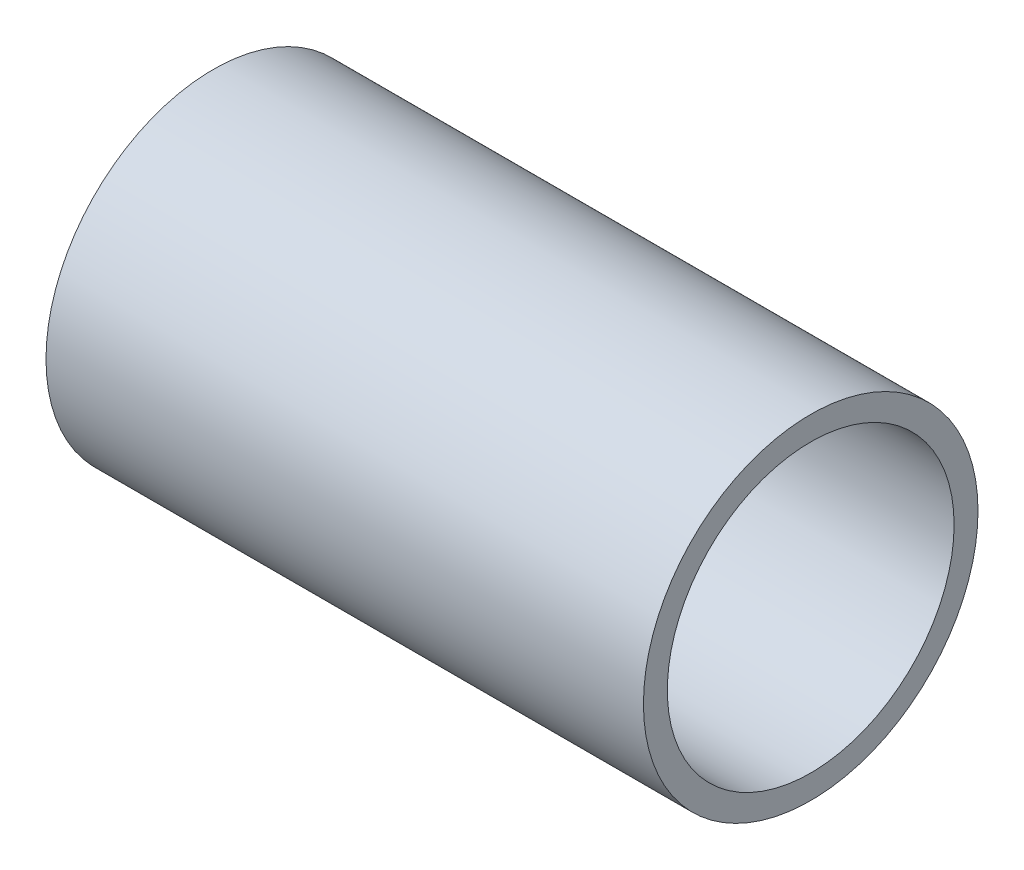
ISO-10303-21;
HEADER;
FILE_DESCRIPTION(('STEP AP214'),'2;1');
FILE_NAME('part.step','',(''),(''),'','','');
FILE_SCHEMA(('AUTOMOTIVE_DESIGN { 1 0 10303 214 1 1 1 1 }'));
ENDSEC;
DATA;
#1=APPLICATION_CONTEXT('core data for automotive mechanical design processes');
#2=APPLICATION_PROTOCOL_DEFINITION('international standard','automotive_design',2000,#1);
#3=PRODUCT_CONTEXT('',#1,'mechanical');
#4=PRODUCT('Part','Part','',(#3));
#5=PRODUCT_RELATED_PRODUCT_CATEGORY('part','',(#4));
#6=PRODUCT_DEFINITION_FORMATION('','',#4);
#7=PRODUCT_DEFINITION_CONTEXT('part definition',#1,'design');
#8=PRODUCT_DEFINITION('design','',#6,#7);
#9=PRODUCT_DEFINITION_SHAPE('','',#8);
#10=(LENGTH_UNIT() NAMED_UNIT(*) SI_UNIT(.MILLI.,.METRE.));
#11=(NAMED_UNIT(*) PLANE_ANGLE_UNIT() SI_UNIT($,.RADIAN.));
#12=(NAMED_UNIT(*) SI_UNIT($,.STERADIAN.) SOLID_ANGLE_UNIT());
#13=UNCERTAINTY_MEASURE_WITH_UNIT(LENGTH_MEASURE(1.E-05),#10,'distance_accuracy_value','');
#14=(GEOMETRIC_REPRESENTATION_CONTEXT(3) GLOBAL_UNCERTAINTY_ASSIGNED_CONTEXT((#13)) GLOBAL_UNIT_ASSIGNED_CONTEXT((#10,
#11,#12)) REPRESENTATION_CONTEXT('',''));
#15=CARTESIAN_POINT('',(0.,0.,0.));
#16=DIRECTION('',(0.,0.,1.));
#17=DIRECTION('',(1.,0.,0.));
#18=AXIS2_PLACEMENT_3D('',#15,#16,#17);
#19=CARTESIAN_POINT('',(-143.225505807351,-1.76370111659328,19.9949035377358));
#20=DIRECTION('',(-1.,0.,0.));
#21=DIRECTION('',(0.,0.,1.));
#22=AXIS2_PLACEMENT_3D('',#19,#20,#21);
#23=PLANE('',#22);
#24=CARTESIAN_POINT('',(-143.225505807351,-1.76370111659328,19.9949035377358));
#25=DIRECTION('',(-1.,0.,0.));
#26=DIRECTION('',(0.,0.,1.));
#27=AXIS2_PLACEMENT_3D('',#24,#25,#26);
#28=CIRCLE('',#27,22.225);
#29=CARTESIAN_POINT('',(-143.225505807351,-1.76370111659328,-2.23009646226419));
#30=VERTEX_POINT('',#29);
#31=EDGE_CURVE('E10',#30,#30,#28,.T.);
#32=ORIENTED_EDGE('',*,*,#31,.T.);
#33=EDGE_LOOP('',(#32));
#34=FACE_BOUND('',#33,.T.);
#35=CARTESIAN_POINT('',(-143.225505807351,-1.76370111659328,19.9949035377358));
#36=DIRECTION('',(-1.,0.,0.));
#37=DIRECTION('',(0.,0.,1.));
#38=AXIS2_PLACEMENT_3D('',#35,#36,#37);
#39=CIRCLE('',#38,19.051016);
#40=CARTESIAN_POINT('',(-143.225505807351,-1.76370111659328,0.943887537735805));
#41=VERTEX_POINT('',#40);
#42=EDGE_CURVE('E46',#41,#41,#39,.T.);
#43=ORIENTED_EDGE('',*,*,#42,.F.);
#44=EDGE_LOOP('',(#43));
#45=FACE_BOUND('',#44,.T.);
#46=ADVANCED_FACE('F35',(#34,#45),#23,.T.);
#47=CARTESIAN_POINT('',(-63.8505058073509,-1.76370111659328,19.9949035377358));
#48=DIRECTION('',(-1.,0.,0.));
#49=DIRECTION('',(0.,0.,1.));
#50=AXIS2_PLACEMENT_3D('',#47,#48,#49);
#51=PLANE('',#50);
#52=CARTESIAN_POINT('',(-63.8505058073509,-1.76370111659328,19.9949035377358));
#53=DIRECTION('',(-1.,0.,0.));
#54=DIRECTION('',(0.,0.,1.));
#55=AXIS2_PLACEMENT_3D('',#52,#53,#54);
#56=CIRCLE('',#55,22.225);
#57=CARTESIAN_POINT('',(-63.8505058073509,-1.76370111659328,-2.23009646226419));
#58=VERTEX_POINT('',#57);
#59=EDGE_CURVE('E39',#58,#58,#56,.T.);
#60=ORIENTED_EDGE('',*,*,#59,.F.);
#61=EDGE_LOOP('',(#60));
#62=FACE_BOUND('',#61,.T.);
#63=CARTESIAN_POINT('',(-63.8505058073509,-1.76370111659328,19.9949035377358));
#64=DIRECTION('',(-1.,0.,0.));
#65=DIRECTION('',(0.,0.,1.));
#66=AXIS2_PLACEMENT_3D('',#63,#64,#65);
#67=CIRCLE('',#66,19.051016);
#68=CARTESIAN_POINT('',(-63.8505058073509,-1.76370111659328,0.943887537735805));
#69=VERTEX_POINT('',#68);
#70=EDGE_CURVE('E48',#69,#69,#67,.T.);
#71=ORIENTED_EDGE('',*,*,#70,.T.);
#72=EDGE_LOOP('',(#71));
#73=FACE_BOUND('',#72,.T.);
#74=ADVANCED_FACE('F58',(#62,#73),#51,.F.);
#75=CARTESIAN_POINT('',(-143.225505807351,-1.76370111659328,19.9949035377358));
#76=DIRECTION('',(1.,0.,0.));
#77=DIRECTION('',(0.,0.,-1.));
#78=AXIS2_PLACEMENT_3D('',#75,#76,#77);
#79=CYLINDRICAL_SURFACE('',#78,22.225);
#80=CARTESIAN_POINT('',(-143.225505807351,-1.76370111659328,-2.23009646226419));
#81=CARTESIAN_POINT('',(-142.398682890684,-1.76370111659328,-2.23009646226419));
#82=CARTESIAN_POINT('',(-141.571859974018,-1.76370111659328,-2.23009646226419));
#83=CARTESIAN_POINT('',(-139.918214140684,-1.76370111659328,-2.23009646226419));
#84=CARTESIAN_POINT('',(-139.091391224018,-1.76370111659328,-2.23009646226419));
#85=CARTESIAN_POINT('',(-137.437745390684,-1.76370111659328,-2.23009646226419));
#86=CARTESIAN_POINT('',(-136.610922474018,-1.76370111659328,-2.23009646226419));
#87=CARTESIAN_POINT('',(-134.957276640684,-1.76370111659328,-2.23009646226419));
#88=CARTESIAN_POINT('',(-134.130453724018,-1.76370111659328,-2.23009646226419));
#89=CARTESIAN_POINT('',(-132.476807890684,-1.76370111659328,-2.23009646226419));
#90=CARTESIAN_POINT('',(-131.649984974018,-1.76370111659328,-2.23009646226419));
#91=CARTESIAN_POINT('',(-129.996339140684,-1.76370111659328,-2.23009646226419));
#92=CARTESIAN_POINT('',(-129.169516224018,-1.76370111659328,-2.23009646226419));
#93=CARTESIAN_POINT('',(-127.515870390684,-1.76370111659328,-2.23009646226419));
#94=CARTESIAN_POINT('',(-126.689047474018,-1.76370111659328,-2.23009646226419));
#95=CARTESIAN_POINT('',(-125.035401640684,-1.76370111659328,-2.23009646226419));
#96=CARTESIAN_POINT('',(-124.208578724018,-1.76370111659328,-2.23009646226419));
#97=CARTESIAN_POINT('',(-122.554932890684,-1.76370111659328,-2.23009646226419));
#98=CARTESIAN_POINT('',(-121.728109974018,-1.76370111659328,-2.23009646226419));
#99=CARTESIAN_POINT('',(-120.074464140684,-1.76370111659328,-2.23009646226419));
#100=CARTESIAN_POINT('',(-119.247641224018,-1.76370111659328,-2.23009646226419));
#101=CARTESIAN_POINT('',(-117.593995390684,-1.76370111659328,-2.23009646226419));
#102=CARTESIAN_POINT('',(-116.767172474018,-1.76370111659328,-2.23009646226419));
#103=CARTESIAN_POINT('',(-115.113526640684,-1.76370111659328,-2.23009646226419));
#104=CARTESIAN_POINT('',(-114.286703724018,-1.76370111659328,-2.23009646226419));
#105=CARTESIAN_POINT('',(-112.633057890684,-1.76370111659328,-2.23009646226419));
#106=CARTESIAN_POINT('',(-111.806234974018,-1.76370111659328,-2.23009646226419));
#107=CARTESIAN_POINT('',(-110.152589140684,-1.76370111659328,-2.23009646226419));
#108=CARTESIAN_POINT('',(-109.325766224018,-1.76370111659328,-2.23009646226419));
#109=CARTESIAN_POINT('',(-107.672120390684,-1.76370111659328,-2.23009646226419));
#110=CARTESIAN_POINT('',(-106.845297474018,-1.76370111659328,-2.23009646226419));
#111=CARTESIAN_POINT('',(-105.191651640684,-1.76370111659328,-2.23009646226419));
#112=CARTESIAN_POINT('',(-104.364828724018,-1.76370111659328,-2.23009646226419));
#113=CARTESIAN_POINT('',(-102.711182890684,-1.76370111659328,-2.23009646226419));
#114=CARTESIAN_POINT('',(-101.884359974018,-1.76370111659328,-2.23009646226419));
#115=CARTESIAN_POINT('',(-100.230714140684,-1.76370111659328,-2.23009646226419));
#116=CARTESIAN_POINT('',(-99.4038912240176,-1.76370111659328,-2.23009646226419));
#117=CARTESIAN_POINT('',(-97.7502453906843,-1.76370111659328,-2.23009646226419));
#118=CARTESIAN_POINT('',(-96.9234224740176,-1.76370111659328,-2.23009646226419));
#119=CARTESIAN_POINT('',(-95.2697766406843,-1.76370111659328,-2.23009646226419));
#120=CARTESIAN_POINT('',(-94.4429537240176,-1.76370111659328,-2.23009646226419));
#121=CARTESIAN_POINT('',(-92.7893078906843,-1.76370111659328,-2.23009646226419));
#122=CARTESIAN_POINT('',(-91.9624849740176,-1.76370111659328,-2.23009646226419));
#123=CARTESIAN_POINT('',(-90.3088391406843,-1.76370111659328,-2.23009646226419));
#124=CARTESIAN_POINT('',(-89.4820162240176,-1.76370111659328,-2.23009646226419));
#125=CARTESIAN_POINT('',(-87.8283703906843,-1.76370111659328,-2.23009646226419));
#126=CARTESIAN_POINT('',(-87.0015474740176,-1.76370111659328,-2.23009646226419));
#127=CARTESIAN_POINT('',(-85.3479016406843,-1.76370111659328,-2.23009646226419));
#128=CARTESIAN_POINT('',(-84.5210787240176,-1.76370111659328,-2.23009646226419));
#129=CARTESIAN_POINT('',(-82.8674328906843,-1.76370111659328,-2.23009646226419));
#130=CARTESIAN_POINT('',(-82.0406099740176,-1.76370111659328,-2.23009646226419));
#131=CARTESIAN_POINT('',(-80.3869641406842,-1.76370111659328,-2.23009646226419));
#132=CARTESIAN_POINT('',(-79.5601412240176,-1.76370111659328,-2.23009646226419));
#133=CARTESIAN_POINT('',(-77.9064953906843,-1.76370111659328,-2.23009646226419));
#134=CARTESIAN_POINT('',(-77.0796724740176,-1.76370111659328,-2.23009646226419));
#135=CARTESIAN_POINT('',(-75.4260266406843,-1.76370111659328,-2.23009646226419));
#136=CARTESIAN_POINT('',(-74.5992037240176,-1.76370111659328,-2.23009646226419));
#137=CARTESIAN_POINT('',(-72.9455578906843,-1.76370111659328,-2.23009646226419));
#138=CARTESIAN_POINT('',(-72.1187349740176,-1.76370111659328,-2.23009646226419));
#139=CARTESIAN_POINT('',(-70.4650891406843,-1.76370111659328,-2.23009646226419));
#140=CARTESIAN_POINT('',(-69.6382662240176,-1.76370111659328,-2.23009646226419));
#141=CARTESIAN_POINT('',(-67.9846203906843,-1.76370111659328,-2.23009646226419));
#142=CARTESIAN_POINT('',(-67.1577974740176,-1.76370111659328,-2.23009646226419));
#143=CARTESIAN_POINT('',(-65.5041516406843,-1.76370111659328,-2.23009646226419));
#144=CARTESIAN_POINT('',(-64.6773287240176,-1.76370111659328,-2.23009646226419));
#145=CARTESIAN_POINT('',(-63.8505058073509,-1.76370111659328,-2.23009646226419));
#146=B_SPLINE_CURVE_WITH_KNOTS('',3,(#80,#81,#82,#83,#84,#85,#86,#87,#88,#89,#90,#91,#92,#93,
#94,#95,#96,#97,#98,#99,#100,#101,#102,#103,#104,#105,#106,#107,#108,#109,#110,#111,#112,#113,
#114,#115,#116,#117,#118,#119,#120,#121,#122,#123,#124,#125,#126,#127,#128,#129,#130,#131,#132,
#133,#134,#135,#136,#137,#138,#139,#140,#141,#142,#143,#144,#145),.UNSPECIFIED.,.F.,.F.,(4,2,2,
2,2,2,2,2,2,2,2,2,2,2,2,2,2,2,2,2,2,2,2,2,2,2,2,2,2,2,2,2,4),(0.,2.48046874999999,
4.96093749999998,7.44140624999998,9.921875,12.40234375,14.8828125,17.36328125,19.84375,
22.32421875,24.8046875,27.28515625,29.765625,32.24609375,34.7265625,37.20703125,39.6875,
42.16796875,44.6484375,47.12890625,49.609375,52.08984375,54.5703125,57.05078125,59.53125,
62.01171875,64.4921875,66.97265625,69.453125,71.93359375,74.4140625,76.89453125,79.375),.UNSPECIFIED.);
#147=EDGE_CURVE('BSEAM37',#30,#58,#146,.T.);
#148=ORIENTED_EDGE('',*,*,#31,.F.);
#149=ORIENTED_EDGE('',*,*,#59,.T.);
#150=ORIENTED_EDGE('',*,*,#147,.T.);
#151=ORIENTED_EDGE('',*,*,#147,.F.);
#152=EDGE_LOOP('',(#148,#150,#149,#151));
#153=FACE_BOUND('',#152,.T.);
#154=ADVANCED_FACE('F37',(#153),#79,.T.);
#155=CARTESIAN_POINT('',(-143.225505807351,-1.76370111659328,19.9949035377358));
#156=DIRECTION('',(1.,0.,0.));
#157=DIRECTION('',(0.,0.,-1.));
#158=AXIS2_PLACEMENT_3D('',#155,#156,#157);
#159=CYLINDRICAL_SURFACE('',#158,19.051016);
#160=CARTESIAN_POINT('',(-143.225505807351,-1.76370111659328,0.943887537735805));
#161=CARTESIAN_POINT('',(-142.398682890684,-1.76370111659328,0.943887537735805));
#162=CARTESIAN_POINT('',(-141.571859974018,-1.76370111659328,0.943887537735805));
#163=CARTESIAN_POINT('',(-139.918214140684,-1.76370111659328,0.943887537735805));
#164=CARTESIAN_POINT('',(-139.091391224018,-1.76370111659328,0.943887537735805));
#165=CARTESIAN_POINT('',(-137.437745390684,-1.76370111659328,0.943887537735805));
#166=CARTESIAN_POINT('',(-136.610922474018,-1.76370111659328,0.943887537735805));
#167=CARTESIAN_POINT('',(-134.957276640684,-1.76370111659328,0.943887537735805));
#168=CARTESIAN_POINT('',(-134.130453724018,-1.76370111659328,0.943887537735805));
#169=CARTESIAN_POINT('',(-132.476807890684,-1.76370111659328,0.943887537735805));
#170=CARTESIAN_POINT('',(-131.649984974018,-1.76370111659328,0.943887537735805));
#171=CARTESIAN_POINT('',(-129.996339140684,-1.76370111659328,0.943887537735805));
#172=CARTESIAN_POINT('',(-129.169516224018,-1.76370111659328,0.943887537735805));
#173=CARTESIAN_POINT('',(-127.515870390684,-1.76370111659328,0.943887537735805));
#174=CARTESIAN_POINT('',(-126.689047474018,-1.76370111659328,0.943887537735805));
#175=CARTESIAN_POINT('',(-125.035401640684,-1.76370111659328,0.943887537735805));
#176=CARTESIAN_POINT('',(-124.208578724018,-1.76370111659328,0.943887537735805));
#177=CARTESIAN_POINT('',(-122.554932890684,-1.76370111659328,0.943887537735805));
#178=CARTESIAN_POINT('',(-121.728109974018,-1.76370111659328,0.943887537735805));
#179=CARTESIAN_POINT('',(-120.074464140684,-1.76370111659328,0.943887537735805));
#180=CARTESIAN_POINT('',(-119.247641224018,-1.76370111659328,0.943887537735805));
#181=CARTESIAN_POINT('',(-117.593995390684,-1.76370111659328,0.943887537735805));
#182=CARTESIAN_POINT('',(-116.767172474018,-1.76370111659328,0.943887537735805));
#183=CARTESIAN_POINT('',(-115.113526640684,-1.76370111659328,0.943887537735805));
#184=CARTESIAN_POINT('',(-114.286703724018,-1.76370111659328,0.943887537735805));
#185=CARTESIAN_POINT('',(-112.633057890684,-1.76370111659328,0.943887537735805));
#186=CARTESIAN_POINT('',(-111.806234974018,-1.76370111659328,0.943887537735805));
#187=CARTESIAN_POINT('',(-110.152589140684,-1.76370111659328,0.943887537735805));
#188=CARTESIAN_POINT('',(-109.325766224018,-1.76370111659328,0.943887537735805));
#189=CARTESIAN_POINT('',(-107.672120390684,-1.76370111659328,0.943887537735805));
#190=CARTESIAN_POINT('',(-106.845297474018,-1.76370111659328,0.943887537735805));
#191=CARTESIAN_POINT('',(-105.191651640684,-1.76370111659328,0.943887537735805));
#192=CARTESIAN_POINT('',(-104.364828724018,-1.76370111659328,0.943887537735805));
#193=CARTESIAN_POINT('',(-102.711182890684,-1.76370111659328,0.943887537735805));
#194=CARTESIAN_POINT('',(-101.884359974018,-1.76370111659328,0.943887537735805));
#195=CARTESIAN_POINT('',(-100.230714140684,-1.76370111659328,0.943887537735805));
#196=CARTESIAN_POINT('',(-99.4038912240176,-1.76370111659328,0.943887537735805));
#197=CARTESIAN_POINT('',(-97.7502453906843,-1.76370111659328,0.943887537735805));
#198=CARTESIAN_POINT('',(-96.9234224740176,-1.76370111659328,0.943887537735805));
#199=CARTESIAN_POINT('',(-95.2697766406843,-1.76370111659328,0.943887537735805));
#200=CARTESIAN_POINT('',(-94.4429537240176,-1.76370111659328,0.943887537735805));
#201=CARTESIAN_POINT('',(-92.7893078906843,-1.76370111659328,0.943887537735805));
#202=CARTESIAN_POINT('',(-91.9624849740176,-1.76370111659328,0.943887537735805));
#203=CARTESIAN_POINT('',(-90.3088391406843,-1.76370111659328,0.943887537735805));
#204=CARTESIAN_POINT('',(-89.4820162240176,-1.76370111659328,0.943887537735805));
#205=CARTESIAN_POINT('',(-87.8283703906843,-1.76370111659328,0.943887537735805));
#206=CARTESIAN_POINT('',(-87.0015474740176,-1.76370111659328,0.943887537735805));
#207=CARTESIAN_POINT('',(-85.3479016406843,-1.76370111659328,0.943887537735805));
#208=CARTESIAN_POINT('',(-84.5210787240176,-1.76370111659328,0.943887537735805));
#209=CARTESIAN_POINT('',(-82.8674328906843,-1.76370111659328,0.943887537735805));
#210=CARTESIAN_POINT('',(-82.0406099740176,-1.76370111659328,0.943887537735805));
#211=CARTESIAN_POINT('',(-80.3869641406842,-1.76370111659328,0.943887537735805));
#212=CARTESIAN_POINT('',(-79.5601412240176,-1.76370111659328,0.943887537735805));
#213=CARTESIAN_POINT('',(-77.9064953906843,-1.76370111659328,0.943887537735805));
#214=CARTESIAN_POINT('',(-77.0796724740176,-1.76370111659328,0.943887537735805));
#215=CARTESIAN_POINT('',(-75.4260266406843,-1.76370111659328,0.943887537735805));
#216=CARTESIAN_POINT('',(-74.5992037240176,-1.76370111659328,0.943887537735805));
#217=CARTESIAN_POINT('',(-72.9455578906843,-1.76370111659328,0.943887537735805));
#218=CARTESIAN_POINT('',(-72.1187349740176,-1.76370111659328,0.943887537735805));
#219=CARTESIAN_POINT('',(-70.4650891406843,-1.76370111659328,0.943887537735805));
#220=CARTESIAN_POINT('',(-69.6382662240176,-1.76370111659328,0.943887537735805));
#221=CARTESIAN_POINT('',(-67.9846203906843,-1.76370111659328,0.943887537735805));
#222=CARTESIAN_POINT('',(-67.1577974740176,-1.76370111659328,0.943887537735805));
#223=CARTESIAN_POINT('',(-65.5041516406843,-1.76370111659328,0.943887537735805));
#224=CARTESIAN_POINT('',(-64.6773287240176,-1.76370111659328,0.943887537735805));
#225=CARTESIAN_POINT('',(-63.8505058073509,-1.76370111659328,0.943887537735805));
#226=B_SPLINE_CURVE_WITH_KNOTS('',3,(#160,#161,#162,#163,#164,#165,#166,#167,#168,#169,#170,
#171,#172,#173,#174,#175,#176,#177,#178,#179,#180,#181,#182,#183,#184,#185,#186,#187,#188,#189,
#190,#191,#192,#193,#194,#195,#196,#197,#198,#199,#200,#201,#202,#203,#204,#205,#206,#207,#208,
#209,#210,#211,#212,#213,#214,#215,#216,#217,#218,#219,#220,#221,#222,#223,#224,#225),
.UNSPECIFIED.,.F.,.F.,(4,2,2,2,2,2,2,2,2,2,2,2,2,2,2,2,2,2,2,2,2,2,2,2,2,2,2,2,2,2,2,2,4),(0.,
2.48046875000002,4.96093750000001,7.44140625,9.92187500000002,12.40234375,14.8828125,
17.36328125,19.84375,22.32421875,24.8046875,27.28515625,29.765625,32.24609375,34.7265625,
37.20703125,39.6875,42.16796875,44.6484375,47.12890625,49.609375,52.08984375,54.5703125,
57.05078125,59.53125,62.01171875,64.4921875,66.97265625,69.453125,71.93359375,74.4140625,
76.89453125,79.375),.UNSPECIFIED.);
#227=EDGE_CURVE('BSEAM54',#41,#69,#226,.T.);
#228=ORIENTED_EDGE('',*,*,#42,.T.);
#229=ORIENTED_EDGE('',*,*,#70,.F.);
#230=ORIENTED_EDGE('',*,*,#227,.T.);
#231=ORIENTED_EDGE('',*,*,#227,.F.);
#232=EDGE_LOOP('',(#228,#230,#229,#231));
#233=FACE_BOUND('',#232,.T.);
#234=ADVANCED_FACE('F54',(#233),#159,.F.);
#235=CLOSED_SHELL('',(#46,#74,#154,#234));
#236=MANIFOLD_SOLID_BREP('B2',#235);
#237=ADVANCED_BREP_SHAPE_REPRESENTATION('',(#18,#236),#14);
#238=SHAPE_DEFINITION_REPRESENTATION(#9,#237);
ENDSEC;
END-ISO-10303-21;
